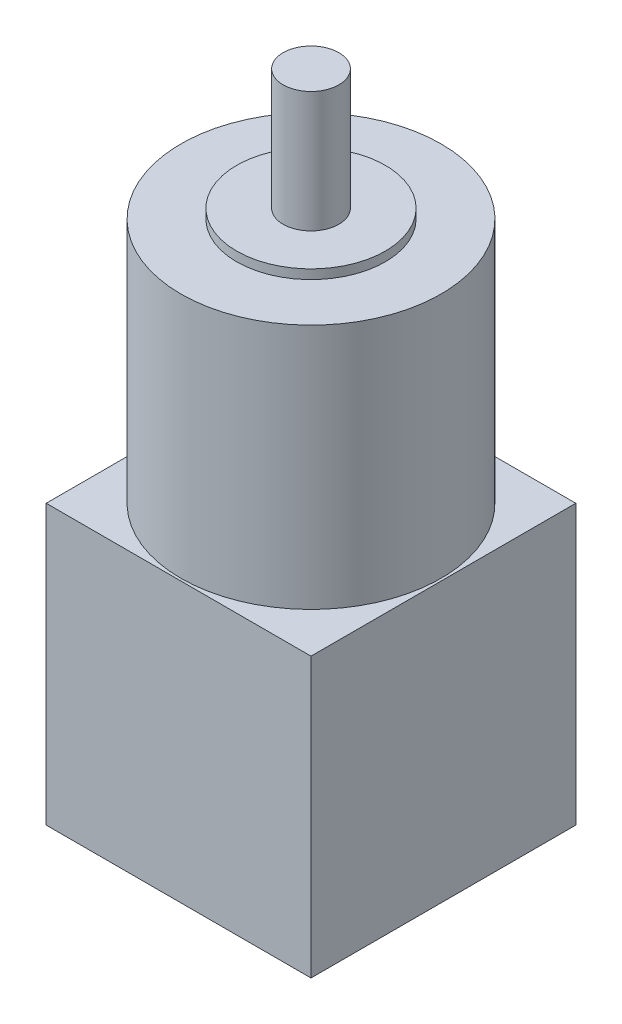
ISO-10303-21;
HEADER;
FILE_DESCRIPTION(('STEP AP214'),'2;1');
FILE_NAME('part.step','',(''),(''),'','','');
FILE_SCHEMA(('AUTOMOTIVE_DESIGN { 1 0 10303 214 1 1 1 1 }'));
ENDSEC;
DATA;
#1=APPLICATION_CONTEXT('core data for automotive mechanical design processes');
#2=APPLICATION_PROTOCOL_DEFINITION('international standard','automotive_design',2000,#1);
#3=PRODUCT_CONTEXT('',#1,'mechanical');
#4=PRODUCT('Part','Part','',(#3));
#5=PRODUCT_RELATED_PRODUCT_CATEGORY('part','',(#4));
#6=PRODUCT_DEFINITION_FORMATION('','',#4);
#7=PRODUCT_DEFINITION_CONTEXT('part definition',#1,'design');
#8=PRODUCT_DEFINITION('design','',#6,#7);
#9=PRODUCT_DEFINITION_SHAPE('','',#8);
#10=(LENGTH_UNIT() NAMED_UNIT(*) SI_UNIT(.MILLI.,.METRE.));
#11=(NAMED_UNIT(*) PLANE_ANGLE_UNIT() SI_UNIT($,.RADIAN.));
#12=(NAMED_UNIT(*) SI_UNIT($,.STERADIAN.) SOLID_ANGLE_UNIT());
#13=UNCERTAINTY_MEASURE_WITH_UNIT(LENGTH_MEASURE(1.E-05),#10,'distance_accuracy_value','');
#14=(GEOMETRIC_REPRESENTATION_CONTEXT(3) GLOBAL_UNCERTAINTY_ASSIGNED_CONTEXT((#13)) GLOBAL_UNIT_ASSIGNED_CONTEXT((#10,
#11,#12)) REPRESENTATION_CONTEXT('',''));
#15=CARTESIAN_POINT('',(0.,0.,0.));
#16=DIRECTION('',(0.,0.,1.));
#17=DIRECTION('',(1.,0.,0.));
#18=AXIS2_PLACEMENT_3D('',#15,#16,#17);
#19=CARTESIAN_POINT('',(0.,53.,0.));
#20=DIRECTION('',(0.,-1.,0.));
#21=DIRECTION('',(0.,0.,-1.));
#22=AXIS2_PLACEMENT_3D('',#19,#20,#21);
#23=CYLINDRICAL_SURFACE('',#22,28.);
#24=CARTESIAN_POINT('',(0.,53.,0.));
#25=DIRECTION('',(0.,1.,0.));
#26=DIRECTION('',(0.,0.,1.));
#27=AXIS2_PLACEMENT_3D('',#24,#25,#26);
#28=CIRCLE('',#27,28.);
#29=CARTESIAN_POINT('',(0.,53.,28.));
#30=VERTEX_POINT('',#29);
#31=EDGE_CURVE('E11',#30,#30,#28,.T.);
#32=ORIENTED_EDGE('',*,*,#31,.F.);
#33=EDGE_LOOP('',(#32));
#34=FACE_BOUND('',#33,.T.);
#35=CARTESIAN_POINT('',(0.,0.,0.));
#36=DIRECTION('',(0.,1.,0.));
#37=DIRECTION('',(0.,0.,1.));
#38=AXIS2_PLACEMENT_3D('',#35,#36,#37);
#39=CIRCLE('',#38,28.);
#40=CARTESIAN_POINT('',(0.,0.,28.));
#41=VERTEX_POINT('',#40);
#42=EDGE_CURVE('E120',#41,#41,#39,.T.);
#43=ORIENTED_EDGE('',*,*,#42,.T.);
#44=EDGE_LOOP('',(#43));
#45=FACE_BOUND('',#44,.T.);
#46=ADVANCED_FACE('F38',(#34,#45),#23,.T.);
#47=CARTESIAN_POINT('',(0.,53.,0.));
#48=DIRECTION('',(0.,1.,0.));
#49=DIRECTION('',(0.,0.,1.));
#50=AXIS2_PLACEMENT_3D('',#47,#48,#49);
#51=PLANE('',#50);
#52=CARTESIAN_POINT('',(0.,53.,0.));
#53=DIRECTION('',(0.,1.,0.));
#54=DIRECTION('',(0.,0.,1.));
#55=AXIS2_PLACEMENT_3D('',#52,#53,#54);
#56=CIRCLE('',#55,16.);
#57=CARTESIAN_POINT('',(0.,53.,16.));
#58=VERTEX_POINT('',#57);
#59=EDGE_CURVE('E127',#58,#58,#56,.T.);
#60=ORIENTED_EDGE('',*,*,#59,.F.);
#61=EDGE_LOOP('',(#60));
#62=FACE_BOUND('',#61,.T.);
#63=ORIENTED_EDGE('',*,*,#31,.T.);
#64=EDGE_LOOP('',(#63));
#65=FACE_BOUND('',#64,.T.);
#66=ADVANCED_FACE('F139',(#62,#65),#51,.T.);
#67=CARTESIAN_POINT('',(0.,55.,0.));
#68=DIRECTION('',(0.,-1.,0.));
#69=DIRECTION('',(0.,0.,-1.));
#70=AXIS2_PLACEMENT_3D('',#67,#68,#69);
#71=CYLINDRICAL_SURFACE('',#70,16.);
#72=CARTESIAN_POINT('',(0.,55.,0.));
#73=DIRECTION('',(0.,1.,0.));
#74=DIRECTION('',(0.,0.,1.));
#75=AXIS2_PLACEMENT_3D('',#72,#73,#74);
#76=CIRCLE('',#75,16.);
#77=CARTESIAN_POINT('',(0.,55.,16.));
#78=VERTEX_POINT('',#77);
#79=EDGE_CURVE('E47',#78,#78,#76,.T.);
#80=ORIENTED_EDGE('',*,*,#79,.F.);
#81=EDGE_LOOP('',(#80));
#82=FACE_BOUND('',#81,.T.);
#83=ORIENTED_EDGE('',*,*,#59,.T.);
#84=EDGE_LOOP('',(#83));
#85=FACE_BOUND('',#84,.T.);
#86=ADVANCED_FACE('F137',(#82,#85),#71,.T.);
#87=CARTESIAN_POINT('',(0.,55.,0.));
#88=DIRECTION('',(0.,1.,0.));
#89=DIRECTION('',(0.,0.,1.));
#90=AXIS2_PLACEMENT_3D('',#87,#88,#89);
#91=PLANE('',#90);
#92=CARTESIAN_POINT('',(0.,55.,0.));
#93=DIRECTION('',(0.,1.,0.));
#94=DIRECTION('',(0.,0.,1.));
#95=AXIS2_PLACEMENT_3D('',#92,#93,#94);
#96=CIRCLE('',#95,6.);
#97=CARTESIAN_POINT('',(0.,55.,-6.));
#98=VERTEX_POINT('',#97);
#99=EDGE_CURVE('E123',#98,#98,#96,.T.);
#100=ORIENTED_EDGE('',*,*,#99,.F.);
#101=EDGE_LOOP('',(#100));
#102=FACE_BOUND('',#101,.T.);
#103=ORIENTED_EDGE('',*,*,#79,.T.);
#104=EDGE_LOOP('',(#103));
#105=FACE_BOUND('',#104,.T.);
#106=ADVANCED_FACE('F176',(#102,#105),#91,.T.);
#107=CARTESIAN_POINT('',(0.,81.,0.));
#108=DIRECTION('',(0.,-1.,0.));
#109=DIRECTION('',(0.,0.,-1.));
#110=AXIS2_PLACEMENT_3D('',#107,#108,#109);
#111=CYLINDRICAL_SURFACE('',#110,6.);
#112=CARTESIAN_POINT('',(0.,81.,0.));
#113=DIRECTION('',(0.,1.,0.));
#114=DIRECTION('',(0.,0.,1.));
#115=AXIS2_PLACEMENT_3D('',#112,#113,#114);
#116=CIRCLE('',#115,6.);
#117=CARTESIAN_POINT('',(0.,81.,-6.));
#118=VERTEX_POINT('',#117);
#119=EDGE_CURVE('E124',#118,#118,#116,.T.);
#120=CARTESIAN_POINT('',(0.,81.,-6.));
#121=CARTESIAN_POINT('',(0.,80.7291666666667,-6.));
#122=CARTESIAN_POINT('',(0.,80.4583333333333,-6.));
#123=CARTESIAN_POINT('',(0.,79.9166666666667,-6.));
#124=CARTESIAN_POINT('',(0.,79.6458333333333,-6.));
#125=CARTESIAN_POINT('',(0.,79.1041666666667,-6.));
#126=CARTESIAN_POINT('',(0.,78.8333333333333,-6.));
#127=CARTESIAN_POINT('',(0.,78.2916666666667,-6.));
#128=CARTESIAN_POINT('',(0.,78.0208333333333,-6.));
#129=CARTESIAN_POINT('',(0.,77.4791666666667,-6.));
#130=CARTESIAN_POINT('',(0.,77.2083333333333,-6.));
#131=CARTESIAN_POINT('',(0.,76.6666666666667,-6.));
#132=CARTESIAN_POINT('',(0.,76.3958333333333,-6.));
#133=CARTESIAN_POINT('',(0.,75.8541666666667,-6.));
#134=CARTESIAN_POINT('',(0.,75.5833333333333,-6.));
#135=CARTESIAN_POINT('',(0.,75.0416666666667,-6.));
#136=CARTESIAN_POINT('',(0.,74.7708333333333,-6.));
#137=CARTESIAN_POINT('',(0.,74.2291666666667,-6.));
#138=CARTESIAN_POINT('',(0.,73.9583333333333,-6.));
#139=CARTESIAN_POINT('',(0.,73.4166666666667,-6.));
#140=CARTESIAN_POINT('',(0.,73.1458333333333,-6.));
#141=CARTESIAN_POINT('',(0.,72.6041666666667,-6.));
#142=CARTESIAN_POINT('',(0.,72.3333333333333,-6.));
#143=CARTESIAN_POINT('',(0.,71.7916666666667,-6.));
#144=CARTESIAN_POINT('',(0.,71.5208333333333,-6.));
#145=CARTESIAN_POINT('',(0.,70.9791666666667,-6.));
#146=CARTESIAN_POINT('',(0.,70.7083333333333,-6.));
#147=CARTESIAN_POINT('',(0.,70.1666666666667,-6.));
#148=CARTESIAN_POINT('',(0.,69.8958333333333,-6.));
#149=CARTESIAN_POINT('',(0.,69.3541666666667,-6.));
#150=CARTESIAN_POINT('',(0.,69.0833333333333,-6.));
#151=CARTESIAN_POINT('',(0.,68.5416666666667,-6.));
#152=CARTESIAN_POINT('',(0.,68.2708333333333,-6.));
#153=CARTESIAN_POINT('',(0.,67.7291666666667,-6.));
#154=CARTESIAN_POINT('',(0.,67.4583333333333,-6.));
#155=CARTESIAN_POINT('',(0.,66.9166666666667,-6.));
#156=CARTESIAN_POINT('',(0.,66.6458333333333,-6.));
#157=CARTESIAN_POINT('',(0.,66.1041666666667,-6.));
#158=CARTESIAN_POINT('',(0.,65.8333333333333,-6.));
#159=CARTESIAN_POINT('',(0.,65.2916666666667,-6.));
#160=CARTESIAN_POINT('',(0.,65.0208333333333,-6.));
#161=CARTESIAN_POINT('',(0.,64.4791666666667,-6.));
#162=CARTESIAN_POINT('',(0.,64.2083333333333,-6.));
#163=CARTESIAN_POINT('',(0.,63.6666666666667,-6.));
#164=CARTESIAN_POINT('',(0.,63.3958333333333,-6.));
#165=CARTESIAN_POINT('',(0.,62.8541666666667,-6.));
#166=CARTESIAN_POINT('',(0.,62.5833333333333,-6.));
#167=CARTESIAN_POINT('',(0.,62.0416666666667,-6.));
#168=CARTESIAN_POINT('',(0.,61.7708333333333,-6.));
#169=CARTESIAN_POINT('',(0.,61.2291666666667,-6.));
#170=CARTESIAN_POINT('',(0.,60.9583333333333,-6.));
#171=CARTESIAN_POINT('',(0.,60.4166666666667,-6.));
#172=CARTESIAN_POINT('',(0.,60.1458333333333,-6.));
#173=CARTESIAN_POINT('',(0.,59.6041666666667,-6.));
#174=CARTESIAN_POINT('',(0.,59.3333333333333,-6.));
#175=CARTESIAN_POINT('',(0.,58.7916666666667,-6.));
#176=CARTESIAN_POINT('',(0.,58.5208333333333,-6.));
#177=CARTESIAN_POINT('',(0.,57.9791666666667,-6.));
#178=CARTESIAN_POINT('',(0.,57.7083333333333,-6.));
#179=CARTESIAN_POINT('',(0.,57.1666666666667,-6.));
#180=CARTESIAN_POINT('',(0.,56.8958333333333,-6.));
#181=CARTESIAN_POINT('',(0.,56.3541666666667,-6.));
#182=CARTESIAN_POINT('',(0.,56.0833333333333,-6.));
#183=CARTESIAN_POINT('',(0.,55.5416666666667,-6.));
#184=CARTESIAN_POINT('',(0.,55.2708333333333,-6.));
#185=CARTESIAN_POINT('',(0.,55.,-6.));
#186=B_SPLINE_CURVE_WITH_KNOTS('',3,(#120,#121,#122,#123,#124,#125,#126,#127,#128,#129,#130,
#131,#132,#133,#134,#135,#136,#137,#138,#139,#140,#141,#142,#143,#144,#145,#146,#147,#148,#149,
#150,#151,#152,#153,#154,#155,#156,#157,#158,#159,#160,#161,#162,#163,#164,#165,#166,#167,#168,
#169,#170,#171,#172,#173,#174,#175,#176,#177,#178,#179,#180,#181,#182,#183,#184,#185),
.UNSPECIFIED.,.F.,.F.,(4,2,2,2,2,2,2,2,2,2,2,2,2,2,2,2,2,2,2,2,2,2,2,2,2,2,2,2,2,2,2,2,4),(0.,
0.812500000000008,1.625,2.43750000000001,3.25,4.06250000000001,4.875,5.68750000000001,
6.50000000000001,7.31250000000001,8.12500000000001,8.9375,9.75000000000001,10.5625,11.375,
12.1875,13.,13.8125,14.625,15.4375,16.25,17.0625,17.875,18.6875,19.5,20.3125,21.125,21.9375,
22.75,23.5625,24.375,25.1875,26.),.UNSPECIFIED.);
#187=EDGE_CURVE('BSEAM172',#118,#98,#186,.T.);
#188=ORIENTED_EDGE('',*,*,#119,.F.);
#189=ORIENTED_EDGE('',*,*,#99,.T.);
#190=ORIENTED_EDGE('',*,*,#187,.T.);
#191=ORIENTED_EDGE('',*,*,#187,.F.);
#192=EDGE_LOOP('',(#188,#190,#189,#191));
#193=FACE_BOUND('',#192,.T.);
#194=ADVANCED_FACE('F172',(#193),#111,.T.);
#195=CARTESIAN_POINT('',(0.,81.,0.));
#196=DIRECTION('',(0.,1.,0.));
#197=DIRECTION('',(0.,0.,1.));
#198=AXIS2_PLACEMENT_3D('',#195,#196,#197);
#199=PLANE('',#198);
#200=ORIENTED_EDGE('',*,*,#119,.T.);
#201=EDGE_LOOP('',(#200));
#202=FACE_BOUND('',#201,.T.);
#203=ADVANCED_FACE('F169',(#202),#199,.T.);
#204=CARTESIAN_POINT('',(28.5,-60.,-28.5));
#205=DIRECTION('',(-1.,0.,0.));
#206=DIRECTION('',(0.,0.,1.));
#207=AXIS2_PLACEMENT_3D('',#204,#205,#206);
#208=PLANE('',#207);
#209=DIRECTION('',(0.,0.,1.));
#210=VECTOR('',#209,1.);
#211=CARTESIAN_POINT('',(28.5,0.,-28.5));
#212=LINE('',#211,#210);
#213=CARTESIAN_POINT('',(28.5,0.,-28.5));
#214=VERTEX_POINT('',#213);
#215=CARTESIAN_POINT('',(28.5,0.,28.5));
#216=VERTEX_POINT('',#215);
#217=EDGE_CURVE('E110',#214,#216,#212,.T.);
#218=ORIENTED_EDGE('',*,*,#217,.T.);
#219=DIRECTION('',(0.,1.,0.));
#220=VECTOR('',#219,1.);
#221=CARTESIAN_POINT('',(28.5,-60.,28.5));
#222=LINE('',#221,#220);
#223=CARTESIAN_POINT('',(28.5,-60.,28.5));
#224=VERTEX_POINT('',#223);
#225=EDGE_CURVE('E100',#224,#216,#222,.T.);
#226=ORIENTED_EDGE('',*,*,#225,.F.);
#227=DIRECTION('',(0.,0.,1.));
#228=VECTOR('',#227,1.);
#229=CARTESIAN_POINT('',(28.5,-60.,-28.5));
#230=LINE('',#229,#228);
#231=CARTESIAN_POINT('',(28.5,-60.,-28.5));
#232=VERTEX_POINT('',#231);
#233=EDGE_CURVE('E92',#232,#224,#230,.T.);
#234=ORIENTED_EDGE('',*,*,#233,.F.);
#235=DIRECTION('',(0.,1.,0.));
#236=VECTOR('',#235,1.);
#237=CARTESIAN_POINT('',(28.5,-60.,-28.5));
#238=LINE('',#237,#236);
#239=EDGE_CURVE('E106',#232,#214,#238,.T.);
#240=ORIENTED_EDGE('',*,*,#239,.T.);
#241=EDGE_LOOP('',(#218,#226,#234,#240));
#242=FACE_BOUND('',#241,.T.);
#243=ADVANCED_FACE('F154',(#242),#208,.F.);
#244=CARTESIAN_POINT('',(-28.5,-60.,28.5));
#245=DIRECTION('',(0.,0.,-1.));
#246=DIRECTION('',(-1.,0.,0.));
#247=AXIS2_PLACEMENT_3D('',#244,#245,#246);
#248=PLANE('',#247);
#249=DIRECTION('',(-1.,0.,0.));
#250=VECTOR('',#249,1.);
#251=CARTESIAN_POINT('',(-28.5,0.,28.5));
#252=LINE('',#251,#250);
#253=CARTESIAN_POINT('',(-28.5,0.,28.5));
#254=VERTEX_POINT('',#253);
#255=EDGE_CURVE('E98',#216,#254,#252,.T.);
#256=ORIENTED_EDGE('',*,*,#255,.T.);
#257=DIRECTION('',(0.,1.,0.));
#258=VECTOR('',#257,1.);
#259=CARTESIAN_POINT('',(-28.5,-60.,28.5));
#260=LINE('',#259,#258);
#261=CARTESIAN_POINT('',(-28.5,-60.,28.5));
#262=VERTEX_POINT('',#261);
#263=EDGE_CURVE('E96',#262,#254,#260,.T.);
#264=ORIENTED_EDGE('',*,*,#263,.F.);
#265=DIRECTION('',(-1.,0.,0.));
#266=VECTOR('',#265,1.);
#267=CARTESIAN_POINT('',(-28.5,-60.,28.5));
#268=LINE('',#267,#266);
#269=EDGE_CURVE('E86',#224,#262,#268,.T.);
#270=ORIENTED_EDGE('',*,*,#269,.F.);
#271=ORIENTED_EDGE('',*,*,#225,.T.);
#272=EDGE_LOOP('',(#256,#264,#270,#271));
#273=FACE_BOUND('',#272,.T.);
#274=ADVANCED_FACE('F97',(#273),#248,.F.);
#275=CARTESIAN_POINT('',(-28.5,-60.,-28.5));
#276=DIRECTION('',(1.,0.,0.));
#277=DIRECTION('',(0.,0.,-1.));
#278=AXIS2_PLACEMENT_3D('',#275,#276,#277);
#279=PLANE('',#278);
#280=DIRECTION('',(0.,0.,-1.));
#281=VECTOR('',#280,1.);
#282=CARTESIAN_POINT('',(-28.5,0.,-28.5));
#283=LINE('',#282,#281);
#284=CARTESIAN_POINT('',(-28.5,0.,-28.5));
#285=VERTEX_POINT('',#284);
#286=EDGE_CURVE('E72',#254,#285,#283,.T.);
#287=ORIENTED_EDGE('',*,*,#286,.T.);
#288=DIRECTION('',(0.,1.,0.));
#289=VECTOR('',#288,1.);
#290=CARTESIAN_POINT('',(-28.5,-60.,-28.5));
#291=LINE('',#290,#289);
#292=CARTESIAN_POINT('',(-28.5,-60.,-28.5));
#293=VERTEX_POINT('',#292);
#294=EDGE_CURVE('E101',#293,#285,#291,.T.);
#295=ORIENTED_EDGE('',*,*,#294,.F.);
#296=DIRECTION('',(0.,0.,-1.));
#297=VECTOR('',#296,1.);
#298=CARTESIAN_POINT('',(-28.5,-60.,-28.5));
#299=LINE('',#298,#297);
#300=EDGE_CURVE('E90',#262,#293,#299,.T.);
#301=ORIENTED_EDGE('',*,*,#300,.F.);
#302=ORIENTED_EDGE('',*,*,#263,.T.);
#303=EDGE_LOOP('',(#287,#295,#301,#302));
#304=FACE_BOUND('',#303,.T.);
#305=ADVANCED_FACE('F103',(#304),#279,.F.);
#306=CARTESIAN_POINT('',(-28.5,-60.,-28.5));
#307=DIRECTION('',(0.,0.,1.));
#308=DIRECTION('',(1.,0.,0.));
#309=AXIS2_PLACEMENT_3D('',#306,#307,#308);
#310=PLANE('',#309);
#311=DIRECTION('',(1.,0.,0.));
#312=VECTOR('',#311,1.);
#313=CARTESIAN_POINT('',(-28.5,0.,-28.5));
#314=LINE('',#313,#312);
#315=EDGE_CURVE('E78',#285,#214,#314,.T.);
#316=ORIENTED_EDGE('',*,*,#315,.T.);
#317=ORIENTED_EDGE('',*,*,#239,.F.);
#318=DIRECTION('',(1.,0.,0.));
#319=VECTOR('',#318,1.);
#320=CARTESIAN_POINT('',(-28.5,-60.,-28.5));
#321=LINE('',#320,#319);
#322=EDGE_CURVE('E55',#293,#232,#321,.T.);
#323=ORIENTED_EDGE('',*,*,#322,.F.);
#324=ORIENTED_EDGE('',*,*,#294,.T.);
#325=EDGE_LOOP('',(#316,#317,#323,#324));
#326=FACE_BOUND('',#325,.T.);
#327=ADVANCED_FACE('F155',(#326),#310,.F.);
#328=CARTESIAN_POINT('',(0.,-60.,0.));
#329=DIRECTION('',(0.,1.,0.));
#330=DIRECTION('',(0.,0.,1.));
#331=AXIS2_PLACEMENT_3D('',#328,#329,#330);
#332=PLANE('',#331);
#333=ORIENTED_EDGE('',*,*,#233,.T.);
#334=ORIENTED_EDGE('',*,*,#269,.T.);
#335=ORIENTED_EDGE('',*,*,#300,.T.);
#336=ORIENTED_EDGE('',*,*,#322,.T.);
#337=EDGE_LOOP('',(#333,#334,#335,#336));
#338=FACE_BOUND('',#337,.T.);
#339=ADVANCED_FACE('F88',(#338),#332,.F.);
#340=CARTESIAN_POINT('',(0.,0.,0.));
#341=DIRECTION('',(0.,1.,0.));
#342=DIRECTION('',(0.,0.,1.));
#343=AXIS2_PLACEMENT_3D('',#340,#341,#342);
#344=PLANE('',#343);
#345=ORIENTED_EDGE('',*,*,#42,.F.);
#346=EDGE_LOOP('',(#345));
#347=FACE_BOUND('',#346,.T.);
#348=ORIENTED_EDGE('',*,*,#217,.F.);
#349=ORIENTED_EDGE('',*,*,#315,.F.);
#350=ORIENTED_EDGE('',*,*,#286,.F.);
#351=ORIENTED_EDGE('',*,*,#255,.F.);
#352=EDGE_LOOP('',(#348,#349,#350,#351));
#353=FACE_BOUND('',#352,.T.);
#354=ADVANCED_FACE('F148',(#347,#353),#344,.T.);
#355=CLOSED_SHELL('',(#46,#66,#86,#106,#194,#203,#243,#274,#305,#327,#339,#354));
#356=MANIFOLD_SOLID_BREP('B2',#355);
#357=ADVANCED_BREP_SHAPE_REPRESENTATION('',(#18,#356),#14);
#358=SHAPE_DEFINITION_REPRESENTATION(#9,#357);
ENDSEC;
END-ISO-10303-21;
